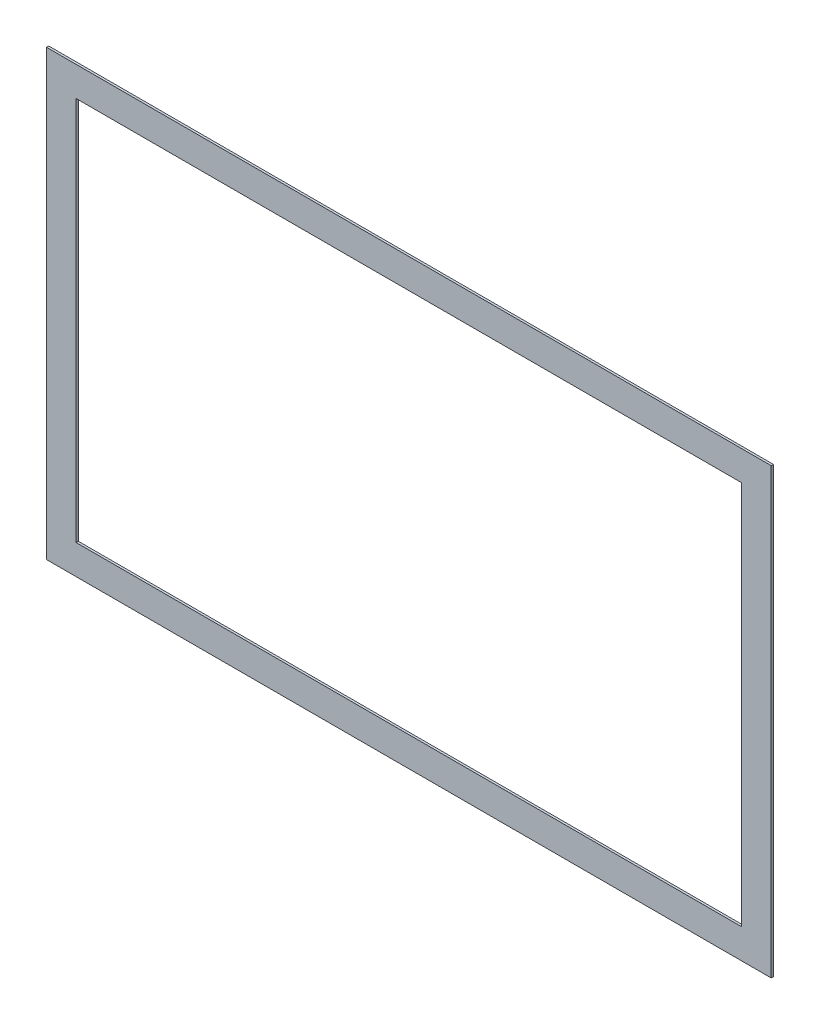
ISO-10303-21;
HEADER;
FILE_DESCRIPTION(('STEP AP214'),'2;1');
FILE_NAME('part.step','',(''),(''),'','','');
FILE_SCHEMA(('AUTOMOTIVE_DESIGN { 1 0 10303 214 1 1 1 1 }'));
ENDSEC;
DATA;
#1=APPLICATION_CONTEXT('core data for automotive mechanical design processes');
#2=APPLICATION_PROTOCOL_DEFINITION('international standard','automotive_design',2000,#1);
#3=PRODUCT_CONTEXT('',#1,'mechanical');
#4=PRODUCT('Part','Part','',(#3));
#5=PRODUCT_RELATED_PRODUCT_CATEGORY('part','',(#4));
#6=PRODUCT_DEFINITION_FORMATION('','',#4);
#7=PRODUCT_DEFINITION_CONTEXT('part definition',#1,'design');
#8=PRODUCT_DEFINITION('design','',#6,#7);
#9=PRODUCT_DEFINITION_SHAPE('','',#8);
#10=(LENGTH_UNIT() NAMED_UNIT(*) SI_UNIT(.MILLI.,.METRE.));
#11=(NAMED_UNIT(*) PLANE_ANGLE_UNIT() SI_UNIT($,.RADIAN.));
#12=(NAMED_UNIT(*) SI_UNIT($,.STERADIAN.) SOLID_ANGLE_UNIT());
#13=UNCERTAINTY_MEASURE_WITH_UNIT(LENGTH_MEASURE(1.E-05),#10,'distance_accuracy_value','');
#14=(GEOMETRIC_REPRESENTATION_CONTEXT(3) GLOBAL_UNCERTAINTY_ASSIGNED_CONTEXT((#13)) GLOBAL_UNIT_ASSIGNED_CONTEXT((#10,
#11,#12)) REPRESENTATION_CONTEXT('',''));
#15=CARTESIAN_POINT('',(0.,0.,0.));
#16=DIRECTION('',(0.,0.,1.));
#17=DIRECTION('',(1.,0.,0.));
#18=AXIS2_PLACEMENT_3D('',#15,#16,#17);
#19=CARTESIAN_POINT('',(0.,0.,40.));
#20=DIRECTION('',(0.,0.,-1.));
#21=DIRECTION('',(-1.,0.,0.));
#22=AXIS2_PLACEMENT_3D('',#19,#20,#21);
#23=PLANE('',#22);
#24=DIRECTION('',(0.,-1.,0.));
#25=VECTOR('',#24,1.);
#26=CARTESIAN_POINT('',(180.,820.,40.));
#27=LINE('',#26,#25);
#28=CARTESIAN_POINT('',(180.,1120.,40.));
#29=VERTEX_POINT('',#28);
#30=CARTESIAN_POINT('',(180.,820.,40.));
#31=VERTEX_POINT('',#30);
#32=EDGE_CURVE('E126',#29,#31,#27,.T.);
#33=ORIENTED_EDGE('',*,*,#32,.T.);
#34=DIRECTION('',(1.,0.,0.));
#35=VECTOR('',#34,1.);
#36=CARTESIAN_POINT('',(180.,820.,40.));
#37=LINE('',#36,#35);
#38=CARTESIAN_POINT('',(670.,820.,40.));
#39=VERTEX_POINT('',#38);
#40=EDGE_CURVE('E129',#31,#39,#37,.T.);
#41=ORIENTED_EDGE('',*,*,#40,.T.);
#42=DIRECTION('',(0.,1.,0.));
#43=VECTOR('',#42,1.);
#44=CARTESIAN_POINT('',(670.,820.,40.));
#45=LINE('',#44,#43);
#46=CARTESIAN_POINT('',(670.,1120.,40.));
#47=VERTEX_POINT('',#46);
#48=EDGE_CURVE('E132',#39,#47,#45,.T.);
#49=ORIENTED_EDGE('',*,*,#48,.T.);
#50=DIRECTION('',(-1.,0.,0.));
#51=VECTOR('',#50,1.);
#52=CARTESIAN_POINT('',(180.,1120.,40.));
#53=LINE('',#52,#51);
#54=EDGE_CURVE('E134',#47,#29,#53,.T.);
#55=ORIENTED_EDGE('',*,*,#54,.T.);
#56=EDGE_LOOP('',(#33,#41,#49,#55));
#57=FACE_BOUND('',#56,.T.);
#58=DIRECTION('',(0.,-1.,0.));
#59=VECTOR('',#58,1.);
#60=CARTESIAN_POINT('',(200.,0.,40.));
#61=LINE('',#60,#59);
#62=CARTESIAN_POINT('',(200.,1100.,40.));
#63=VERTEX_POINT('',#62);
#64=CARTESIAN_POINT('',(200.,840.,40.));
#65=VERTEX_POINT('',#64);
#66=EDGE_CURVE('E112',#63,#65,#61,.T.);
#67=ORIENTED_EDGE('',*,*,#66,.F.);
#68=DIRECTION('',(-1.,0.,0.));
#69=VECTOR('',#68,1.);
#70=CARTESIAN_POINT('',(0.,1100.,40.));
#71=LINE('',#70,#69);
#72=CARTESIAN_POINT('',(650.,1100.,40.));
#73=VERTEX_POINT('',#72);
#74=EDGE_CURVE('E101',#73,#63,#71,.T.);
#75=ORIENTED_EDGE('',*,*,#74,.F.);
#76=DIRECTION('',(0.,1.,0.));
#77=VECTOR('',#76,1.);
#78=CARTESIAN_POINT('',(650.,0.,40.));
#79=LINE('',#78,#77);
#80=CARTESIAN_POINT('',(650.,840.,40.));
#81=VERTEX_POINT('',#80);
#82=EDGE_CURVE('E106',#81,#73,#79,.T.);
#83=ORIENTED_EDGE('',*,*,#82,.F.);
#84=DIRECTION('',(1.,0.,0.));
#85=VECTOR('',#84,1.);
#86=CARTESIAN_POINT('',(0.,840.,40.));
#87=LINE('',#86,#85);
#88=EDGE_CURVE('E117',#65,#81,#87,.T.);
#89=ORIENTED_EDGE('',*,*,#88,.F.);
#90=EDGE_LOOP('',(#67,#75,#83,#89));
#91=FACE_BOUND('',#90,.T.);
#92=ADVANCED_FACE('F39',(#57,#91),#23,.F.);
#93=CARTESIAN_POINT('',(0.,0.,38.5));
#94=DIRECTION('',(0.,0.,-1.));
#95=DIRECTION('',(-1.,0.,0.));
#96=AXIS2_PLACEMENT_3D('',#93,#94,#95);
#97=PLANE('',#96);
#98=DIRECTION('',(0.,-1.,0.));
#99=VECTOR('',#98,1.);
#100=CARTESIAN_POINT('',(180.,820.,38.5));
#101=LINE('',#100,#99);
#102=CARTESIAN_POINT('',(180.,1120.,38.5));
#103=VERTEX_POINT('',#102);
#104=CARTESIAN_POINT('',(180.,820.,38.5));
#105=VERTEX_POINT('',#104);
#106=EDGE_CURVE('E118',#103,#105,#101,.T.);
#107=ORIENTED_EDGE('',*,*,#106,.F.);
#108=DIRECTION('',(-1.,0.,0.));
#109=VECTOR('',#108,1.);
#110=CARTESIAN_POINT('',(180.,1120.,38.5));
#111=LINE('',#110,#109);
#112=CARTESIAN_POINT('',(670.,1120.,38.5));
#113=VERTEX_POINT('',#112);
#114=EDGE_CURVE('E130',#113,#103,#111,.T.);
#115=ORIENTED_EDGE('',*,*,#114,.F.);
#116=DIRECTION('',(0.,1.,0.));
#117=VECTOR('',#116,1.);
#118=CARTESIAN_POINT('',(670.,820.,38.5));
#119=LINE('',#118,#117);
#120=CARTESIAN_POINT('',(670.,820.,38.5));
#121=VERTEX_POINT('',#120);
#122=EDGE_CURVE('E138',#121,#113,#119,.T.);
#123=ORIENTED_EDGE('',*,*,#122,.F.);
#124=DIRECTION('',(1.,0.,0.));
#125=VECTOR('',#124,1.);
#126=CARTESIAN_POINT('',(180.,820.,38.5));
#127=LINE('',#126,#125);
#128=EDGE_CURVE('E121',#105,#121,#127,.T.);
#129=ORIENTED_EDGE('',*,*,#128,.F.);
#130=EDGE_LOOP('',(#107,#115,#123,#129));
#131=FACE_BOUND('',#130,.T.);
#132=DIRECTION('',(-1.,0.,0.));
#133=VECTOR('',#132,1.);
#134=CARTESIAN_POINT('',(0.,1100.,38.5));
#135=LINE('',#134,#133);
#136=CARTESIAN_POINT('',(650.,1100.,38.5));
#137=VERTEX_POINT('',#136);
#138=CARTESIAN_POINT('',(200.,1100.,38.5));
#139=VERTEX_POINT('',#138);
#140=EDGE_CURVE('E152',#137,#139,#135,.T.);
#141=ORIENTED_EDGE('',*,*,#140,.T.);
#142=DIRECTION('',(0.,-1.,0.));
#143=VECTOR('',#142,1.);
#144=CARTESIAN_POINT('',(200.,0.,38.5));
#145=LINE('',#144,#143);
#146=CARTESIAN_POINT('',(200.,840.,38.5));
#147=VERTEX_POINT('',#146);
#148=EDGE_CURVE('E11',#139,#147,#145,.T.);
#149=ORIENTED_EDGE('',*,*,#148,.T.);
#150=DIRECTION('',(1.,0.,0.));
#151=VECTOR('',#150,1.);
#152=CARTESIAN_POINT('',(0.,840.,38.5));
#153=LINE('',#152,#151);
#154=CARTESIAN_POINT('',(650.,840.,38.5));
#155=VERTEX_POINT('',#154);
#156=EDGE_CURVE('E47',#147,#155,#153,.T.);
#157=ORIENTED_EDGE('',*,*,#156,.T.);
#158=DIRECTION('',(0.,1.,0.));
#159=VECTOR('',#158,1.);
#160=CARTESIAN_POINT('',(650.,0.,38.5));
#161=LINE('',#160,#159);
#162=EDGE_CURVE('E154',#155,#137,#161,.T.);
#163=ORIENTED_EDGE('',*,*,#162,.T.);
#164=EDGE_LOOP('',(#141,#149,#157,#163));
#165=FACE_BOUND('',#164,.T.);
#166=ADVANCED_FACE('F158',(#131,#165),#97,.T.);
#167=CARTESIAN_POINT('',(180.,820.,40.));
#168=DIRECTION('',(1.,0.,0.));
#169=DIRECTION('',(0.,0.,-1.));
#170=AXIS2_PLACEMENT_3D('',#167,#168,#169);
#171=PLANE('',#170);
#172=ORIENTED_EDGE('',*,*,#106,.T.);
#173=DIRECTION('',(0.,0.,-1.));
#174=VECTOR('',#173,1.);
#175=CARTESIAN_POINT('',(180.,820.,40.));
#176=LINE('',#175,#174);
#177=EDGE_CURVE('E149',#31,#105,#176,.T.);
#178=ORIENTED_EDGE('',*,*,#177,.F.);
#179=ORIENTED_EDGE('',*,*,#32,.F.);
#180=DIRECTION('',(0.,0.,-1.));
#181=VECTOR('',#180,1.);
#182=CARTESIAN_POINT('',(180.,1120.,40.));
#183=LINE('',#182,#181);
#184=EDGE_CURVE('E135',#29,#103,#183,.T.);
#185=ORIENTED_EDGE('',*,*,#184,.T.);
#186=EDGE_LOOP('',(#172,#178,#179,#185));
#187=FACE_BOUND('',#186,.T.);
#188=ADVANCED_FACE('F41',(#187),#171,.F.);
#189=CARTESIAN_POINT('',(180.,820.,40.));
#190=DIRECTION('',(0.,1.,0.));
#191=DIRECTION('',(0.,0.,1.));
#192=AXIS2_PLACEMENT_3D('',#189,#190,#191);
#193=PLANE('',#192);
#194=ORIENTED_EDGE('',*,*,#128,.T.);
#195=DIRECTION('',(0.,0.,-1.));
#196=VECTOR('',#195,1.);
#197=CARTESIAN_POINT('',(670.,820.,40.));
#198=LINE('',#197,#196);
#199=EDGE_CURVE('E146',#39,#121,#198,.T.);
#200=ORIENTED_EDGE('',*,*,#199,.F.);
#201=ORIENTED_EDGE('',*,*,#40,.F.);
#202=ORIENTED_EDGE('',*,*,#177,.T.);
#203=EDGE_LOOP('',(#194,#200,#201,#202));
#204=FACE_BOUND('',#203,.T.);
#205=ADVANCED_FACE('F193',(#204),#193,.F.);
#206=CARTESIAN_POINT('',(670.,820.,40.));
#207=DIRECTION('',(-1.,0.,0.));
#208=DIRECTION('',(0.,0.,1.));
#209=AXIS2_PLACEMENT_3D('',#206,#207,#208);
#210=PLANE('',#209);
#211=ORIENTED_EDGE('',*,*,#122,.T.);
#212=DIRECTION('',(0.,0.,-1.));
#213=VECTOR('',#212,1.);
#214=CARTESIAN_POINT('',(670.,1120.,40.));
#215=LINE('',#214,#213);
#216=EDGE_CURVE('E143',#47,#113,#215,.T.);
#217=ORIENTED_EDGE('',*,*,#216,.F.);
#218=ORIENTED_EDGE('',*,*,#48,.F.);
#219=ORIENTED_EDGE('',*,*,#199,.T.);
#220=EDGE_LOOP('',(#211,#217,#218,#219));
#221=FACE_BOUND('',#220,.T.);
#222=ADVANCED_FACE('F190',(#221),#210,.F.);
#223=CARTESIAN_POINT('',(180.,1120.,40.));
#224=DIRECTION('',(0.,-1.,0.));
#225=DIRECTION('',(0.,0.,-1.));
#226=AXIS2_PLACEMENT_3D('',#223,#224,#225);
#227=PLANE('',#226);
#228=ORIENTED_EDGE('',*,*,#114,.T.);
#229=ORIENTED_EDGE('',*,*,#184,.F.);
#230=ORIENTED_EDGE('',*,*,#54,.F.);
#231=ORIENTED_EDGE('',*,*,#216,.T.);
#232=EDGE_LOOP('',(#228,#229,#230,#231));
#233=FACE_BOUND('',#232,.T.);
#234=ADVANCED_FACE('F188',(#233),#227,.F.);
#235=CARTESIAN_POINT('',(200.,840.,41.));
#236=DIRECTION('',(1.,0.,0.));
#237=DIRECTION('',(0.,0.,-1.));
#238=AXIS2_PLACEMENT_3D('',#235,#236,#237);
#239=PLANE('',#238);
#240=ORIENTED_EDGE('',*,*,#66,.T.);
#241=DIRECTION('',(0.,0.,-1.));
#242=VECTOR('',#241,1.);
#243=CARTESIAN_POINT('',(200.,840.,41.));
#244=LINE('',#243,#242);
#245=EDGE_CURVE('E107',#65,#147,#244,.T.);
#246=ORIENTED_EDGE('',*,*,#245,.T.);
#247=ORIENTED_EDGE('',*,*,#148,.F.);
#248=DIRECTION('',(0.,0.,-1.));
#249=VECTOR('',#248,1.);
#250=CARTESIAN_POINT('',(200.,1100.,41.));
#251=LINE('',#250,#249);
#252=EDGE_CURVE('E59',#63,#139,#251,.T.);
#253=ORIENTED_EDGE('',*,*,#252,.F.);
#254=EDGE_LOOP('',(#240,#246,#247,#253));
#255=FACE_BOUND('',#254,.T.);
#256=ADVANCED_FACE('F110',(#255),#239,.T.);
#257=CARTESIAN_POINT('',(200.,840.,41.));
#258=DIRECTION('',(0.,1.,0.));
#259=DIRECTION('',(0.,0.,1.));
#260=AXIS2_PLACEMENT_3D('',#257,#258,#259);
#261=PLANE('',#260);
#262=ORIENTED_EDGE('',*,*,#88,.T.);
#263=DIRECTION('',(0.,0.,-1.));
#264=VECTOR('',#263,1.);
#265=CARTESIAN_POINT('',(650.,840.,41.));
#266=LINE('',#265,#264);
#267=EDGE_CURVE('E163',#81,#155,#266,.T.);
#268=ORIENTED_EDGE('',*,*,#267,.T.);
#269=ORIENTED_EDGE('',*,*,#156,.F.);
#270=ORIENTED_EDGE('',*,*,#245,.F.);
#271=EDGE_LOOP('',(#262,#268,#269,#270));
#272=FACE_BOUND('',#271,.T.);
#273=ADVANCED_FACE('F161',(#272),#261,.T.);
#274=CARTESIAN_POINT('',(650.,840.,41.));
#275=DIRECTION('',(-1.,0.,0.));
#276=DIRECTION('',(0.,0.,1.));
#277=AXIS2_PLACEMENT_3D('',#274,#275,#276);
#278=PLANE('',#277);
#279=ORIENTED_EDGE('',*,*,#82,.T.);
#280=DIRECTION('',(0.,0.,-1.));
#281=VECTOR('',#280,1.);
#282=CARTESIAN_POINT('',(650.,1100.,41.));
#283=LINE('',#282,#281);
#284=EDGE_CURVE('E54',#73,#137,#283,.T.);
#285=ORIENTED_EDGE('',*,*,#284,.T.);
#286=ORIENTED_EDGE('',*,*,#162,.F.);
#287=ORIENTED_EDGE('',*,*,#267,.F.);
#288=EDGE_LOOP('',(#279,#285,#286,#287));
#289=FACE_BOUND('',#288,.T.);
#290=ADVANCED_FACE('F168',(#289),#278,.T.);
#291=CARTESIAN_POINT('',(200.,1100.,41.));
#292=DIRECTION('',(0.,-1.,0.));
#293=DIRECTION('',(0.,0.,-1.));
#294=AXIS2_PLACEMENT_3D('',#291,#292,#293);
#295=PLANE('',#294);
#296=ORIENTED_EDGE('',*,*,#74,.T.);
#297=ORIENTED_EDGE('',*,*,#252,.T.);
#298=ORIENTED_EDGE('',*,*,#140,.F.);
#299=ORIENTED_EDGE('',*,*,#284,.F.);
#300=EDGE_LOOP('',(#296,#297,#298,#299));
#301=FACE_BOUND('',#300,.T.);
#302=ADVANCED_FACE('F102',(#301),#295,.T.);
#303=CLOSED_SHELL('',(#92,#166,#188,#205,#222,#234,#256,#273,#290,#302));
#304=MANIFOLD_SOLID_BREP('B2',#303);
#305=ADVANCED_BREP_SHAPE_REPRESENTATION('',(#18,#304),#14);
#306=SHAPE_DEFINITION_REPRESENTATION(#9,#305);
ENDSEC;
END-ISO-10303-21;
